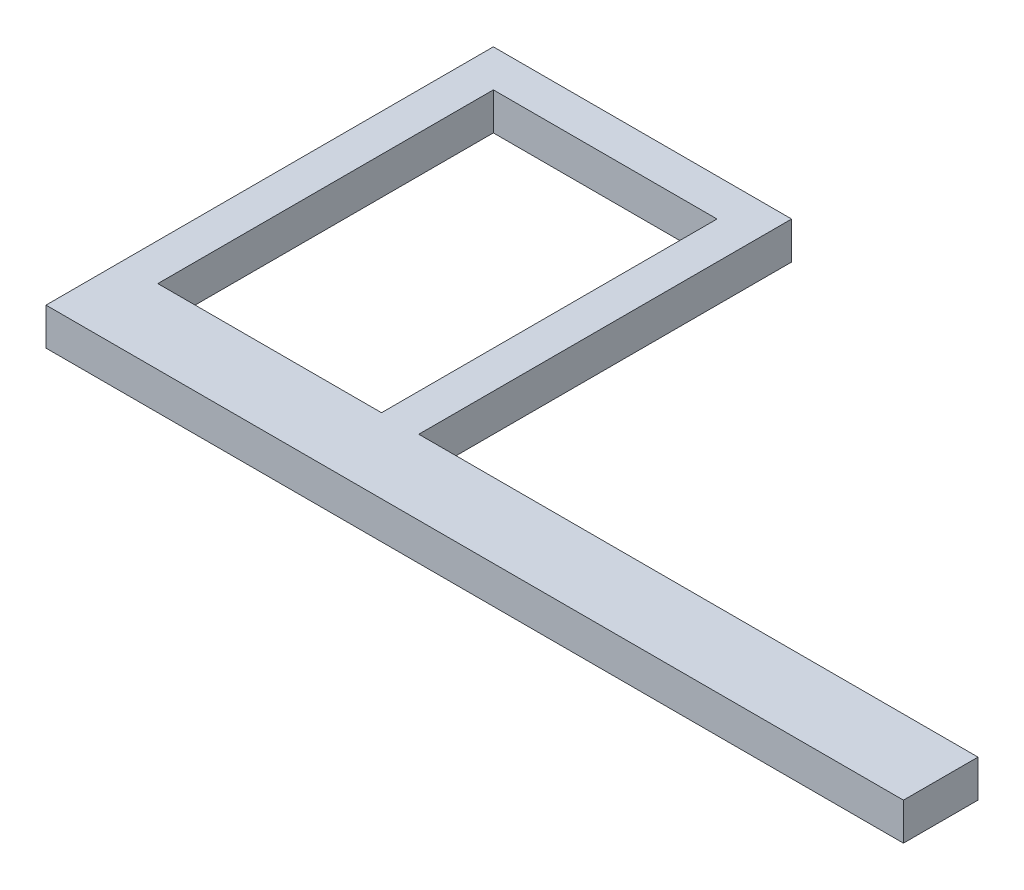
ISO-10303-21;
HEADER;
FILE_DESCRIPTION(('STEP AP214'),'2;1');
FILE_NAME('part.step','',(''),(''),'','','');
FILE_SCHEMA(('AUTOMOTIVE_DESIGN { 1 0 10303 214 1 1 1 1 }'));
ENDSEC;
DATA;
#1=APPLICATION_CONTEXT('core data for automotive mechanical design processes');
#2=APPLICATION_PROTOCOL_DEFINITION('international standard','automotive_design',2000,#1);
#3=PRODUCT_CONTEXT('',#1,'mechanical');
#4=PRODUCT('Part','Part','',(#3));
#5=PRODUCT_RELATED_PRODUCT_CATEGORY('part','',(#4));
#6=PRODUCT_DEFINITION_FORMATION('','',#4);
#7=PRODUCT_DEFINITION_CONTEXT('part definition',#1,'design');
#8=PRODUCT_DEFINITION('design','',#6,#7);
#9=PRODUCT_DEFINITION_SHAPE('','',#8);
#10=(LENGTH_UNIT() NAMED_UNIT(*) SI_UNIT(.MILLI.,.METRE.));
#11=(NAMED_UNIT(*) PLANE_ANGLE_UNIT() SI_UNIT($,.RADIAN.));
#12=(NAMED_UNIT(*) SI_UNIT($,.STERADIAN.) SOLID_ANGLE_UNIT());
#13=UNCERTAINTY_MEASURE_WITH_UNIT(LENGTH_MEASURE(1.E-05),#10,'distance_accuracy_value','');
#14=(GEOMETRIC_REPRESENTATION_CONTEXT(3) GLOBAL_UNCERTAINTY_ASSIGNED_CONTEXT((#13)) GLOBAL_UNIT_ASSIGNED_CONTEXT((#10,
#11,#12)) REPRESENTATION_CONTEXT('',''));
#15=CARTESIAN_POINT('',(0.,0.,0.));
#16=DIRECTION('',(0.,0.,1.));
#17=DIRECTION('',(1.,0.,0.));
#18=AXIS2_PLACEMENT_3D('',#15,#16,#17);
#19=CARTESIAN_POINT('',(-69.9051094890511,5.,-48.4014598540146));
#20=DIRECTION('',(0.,0.,1.));
#21=DIRECTION('',(1.,0.,0.));
#22=AXIS2_PLACEMENT_3D('',#19,#20,#21);
#23=PLANE('',#22);
#24=DIRECTION('',(-1.,0.,0.));
#25=VECTOR('',#24,1.);
#26=CARTESIAN_POINT('',(-69.9051094890511,0.,-48.4014598540146));
#27=LINE('',#26,#25);
#28=CARTESIAN_POINT('',(-69.9051094890511,0.,-48.4014598540146));
#29=VERTEX_POINT('',#28);
#30=CARTESIAN_POINT('',(-109.905109489051,0.,-48.4014598540146));
#31=VERTEX_POINT('',#30);
#32=EDGE_CURVE('E148',#29,#31,#27,.T.);
#33=ORIENTED_EDGE('',*,*,#32,.T.);
#34=DIRECTION('',(0.,-1.,0.));
#35=VECTOR('',#34,1.);
#36=CARTESIAN_POINT('',(-109.905109489051,5.,-48.4014598540146));
#37=LINE('',#36,#35);
#38=CARTESIAN_POINT('',(-109.905109489051,5.,-48.4014598540146));
#39=VERTEX_POINT('',#38);
#40=EDGE_CURVE('E11',#39,#31,#37,.T.);
#41=ORIENTED_EDGE('',*,*,#40,.F.);
#42=DIRECTION('',(-1.,0.,0.));
#43=VECTOR('',#42,1.);
#44=CARTESIAN_POINT('',(-69.9051094890511,5.,-48.4014598540146));
#45=LINE('',#44,#43);
#46=CARTESIAN_POINT('',(-69.9051094890511,5.,-48.4014598540146));
#47=VERTEX_POINT('',#46);
#48=EDGE_CURVE('E152',#47,#39,#45,.T.);
#49=ORIENTED_EDGE('',*,*,#48,.F.);
#50=DIRECTION('',(0.,-1.,0.));
#51=VECTOR('',#50,1.);
#52=CARTESIAN_POINT('',(-69.9051094890511,5.,-48.4014598540146));
#53=LINE('',#52,#51);
#54=EDGE_CURVE('E166',#47,#29,#53,.T.);
#55=ORIENTED_EDGE('',*,*,#54,.T.);
#56=EDGE_LOOP('',(#33,#41,#49,#55));
#57=FACE_BOUND('',#56,.T.);
#58=ADVANCED_FACE('F39',(#57),#23,.F.);
#59=CARTESIAN_POINT('',(-109.905109489051,5.,-48.4014598540146));
#60=DIRECTION('',(1.,0.,0.));
#61=DIRECTION('',(0.,0.,-1.));
#62=AXIS2_PLACEMENT_3D('',#59,#60,#61);
#63=PLANE('',#62);
#64=DIRECTION('',(0.,0.,1.));
#65=VECTOR('',#64,1.);
#66=CARTESIAN_POINT('',(-109.905109489051,0.,-48.4014598540146));
#67=LINE('',#66,#65);
#68=CARTESIAN_POINT('',(-109.905109489051,0.,11.5985401459854));
#69=VERTEX_POINT('',#68);
#70=EDGE_CURVE('E169',#31,#69,#67,.T.);
#71=ORIENTED_EDGE('',*,*,#70,.T.);
#72=DIRECTION('',(0.,-1.,0.));
#73=VECTOR('',#72,1.);
#74=CARTESIAN_POINT('',(-109.905109489051,5.,11.5985401459854));
#75=LINE('',#74,#73);
#76=CARTESIAN_POINT('',(-109.905109489051,5.,11.5985401459854));
#77=VERTEX_POINT('',#76);
#78=EDGE_CURVE('E46',#77,#69,#75,.T.);
#79=ORIENTED_EDGE('',*,*,#78,.F.);
#80=DIRECTION('',(0.,0.,1.));
#81=VECTOR('',#80,1.);
#82=CARTESIAN_POINT('',(-109.905109489051,5.,-48.4014598540146));
#83=LINE('',#82,#81);
#84=EDGE_CURVE('E155',#39,#77,#83,.T.);
#85=ORIENTED_EDGE('',*,*,#84,.F.);
#86=ORIENTED_EDGE('',*,*,#40,.T.);
#87=EDGE_LOOP('',(#71,#79,#85,#86));
#88=FACE_BOUND('',#87,.T.);
#89=ADVANCED_FACE('F214',(#88),#63,.F.);
#90=CARTESIAN_POINT('',(-109.905109489051,5.,11.5985401459854));
#91=DIRECTION('',(0.,0.,-1.));
#92=DIRECTION('',(-1.,0.,0.));
#93=AXIS2_PLACEMENT_3D('',#90,#91,#92);
#94=PLANE('',#93);
#95=DIRECTION('',(1.,0.,0.));
#96=VECTOR('',#95,1.);
#97=CARTESIAN_POINT('',(-109.905109489051,0.,11.5985401459854));
#98=LINE('',#97,#96);
#99=CARTESIAN_POINT('',(5.09489051094891,0.,11.5985401459854));
#100=VERTEX_POINT('',#99);
#101=EDGE_CURVE('E171',#69,#100,#98,.T.);
#102=ORIENTED_EDGE('',*,*,#101,.T.);
#103=DIRECTION('',(0.,-1.,0.));
#104=VECTOR('',#103,1.);
#105=CARTESIAN_POINT('',(5.09489051094891,5.,11.5985401459854));
#106=LINE('',#105,#104);
#107=CARTESIAN_POINT('',(5.09489051094891,5.,11.5985401459854));
#108=VERTEX_POINT('',#107);
#109=EDGE_CURVE('E186',#108,#100,#106,.T.);
#110=ORIENTED_EDGE('',*,*,#109,.F.);
#111=DIRECTION('',(1.,0.,0.));
#112=VECTOR('',#111,1.);
#113=CARTESIAN_POINT('',(-109.905109489051,5.,11.5985401459854));
#114=LINE('',#113,#112);
#115=EDGE_CURVE('E158',#77,#108,#114,.T.);
#116=ORIENTED_EDGE('',*,*,#115,.F.);
#117=ORIENTED_EDGE('',*,*,#78,.T.);
#118=EDGE_LOOP('',(#102,#110,#116,#117));
#119=FACE_BOUND('',#118,.T.);
#120=ADVANCED_FACE('F193',(#119),#94,.F.);
#121=CARTESIAN_POINT('',(5.09489051094891,5.,11.5985401459854));
#122=DIRECTION('',(-1.,0.,0.));
#123=DIRECTION('',(0.,0.,1.));
#124=AXIS2_PLACEMENT_3D('',#121,#122,#123);
#125=PLANE('',#124);
#126=DIRECTION('',(0.,0.,-1.));
#127=VECTOR('',#126,1.);
#128=CARTESIAN_POINT('',(5.09489051094891,0.,11.5985401459854));
#129=LINE('',#128,#127);
#130=CARTESIAN_POINT('',(5.09489051094891,0.,1.5985401459854));
#131=VERTEX_POINT('',#130);
#132=EDGE_CURVE('E173',#100,#131,#129,.T.);
#133=ORIENTED_EDGE('',*,*,#132,.T.);
#134=DIRECTION('',(0.,-1.,0.));
#135=VECTOR('',#134,1.);
#136=CARTESIAN_POINT('',(5.09489051094891,5.,1.5985401459854));
#137=LINE('',#136,#135);
#138=CARTESIAN_POINT('',(5.09489051094891,5.,1.5985401459854));
#139=VERTEX_POINT('',#138);
#140=EDGE_CURVE('E183',#139,#131,#137,.T.);
#141=ORIENTED_EDGE('',*,*,#140,.F.);
#142=DIRECTION('',(0.,0.,-1.));
#143=VECTOR('',#142,1.);
#144=CARTESIAN_POINT('',(5.09489051094891,5.,11.5985401459854));
#145=LINE('',#144,#143);
#146=EDGE_CURVE('E160',#108,#139,#145,.T.);
#147=ORIENTED_EDGE('',*,*,#146,.F.);
#148=ORIENTED_EDGE('',*,*,#109,.T.);
#149=EDGE_LOOP('',(#133,#141,#147,#148));
#150=FACE_BOUND('',#149,.T.);
#151=ADVANCED_FACE('F202',(#150),#125,.F.);
#152=CARTESIAN_POINT('',(5.09489051094891,5.,1.5985401459854));
#153=DIRECTION('',(0.,0.,1.));
#154=DIRECTION('',(1.,0.,0.));
#155=AXIS2_PLACEMENT_3D('',#152,#153,#154);
#156=PLANE('',#155);
#157=DIRECTION('',(-1.,0.,0.));
#158=VECTOR('',#157,1.);
#159=CARTESIAN_POINT('',(5.09489051094891,0.,1.5985401459854));
#160=LINE('',#159,#158);
#161=CARTESIAN_POINT('',(-69.9051094890511,0.,1.59854014598541));
#162=VERTEX_POINT('',#161);
#163=EDGE_CURVE('E175',#131,#162,#160,.T.);
#164=ORIENTED_EDGE('',*,*,#163,.T.);
#165=DIRECTION('',(0.,-1.,0.));
#166=VECTOR('',#165,1.);
#167=CARTESIAN_POINT('',(-69.9051094890511,5.,1.59854014598541));
#168=LINE('',#167,#166);
#169=CARTESIAN_POINT('',(-69.9051094890511,5.,1.59854014598541));
#170=VERTEX_POINT('',#169);
#171=EDGE_CURVE('E180',#170,#162,#168,.T.);
#172=ORIENTED_EDGE('',*,*,#171,.F.);
#173=DIRECTION('',(-1.,0.,0.));
#174=VECTOR('',#173,1.);
#175=CARTESIAN_POINT('',(5.09489051094891,5.,1.5985401459854));
#176=LINE('',#175,#174);
#177=EDGE_CURVE('E162',#139,#170,#176,.T.);
#178=ORIENTED_EDGE('',*,*,#177,.F.);
#179=ORIENTED_EDGE('',*,*,#140,.T.);
#180=EDGE_LOOP('',(#164,#172,#178,#179));
#181=FACE_BOUND('',#180,.T.);
#182=ADVANCED_FACE('F206',(#181),#156,.F.);
#183=CARTESIAN_POINT('',(-69.9051094890511,5.,1.59854014598541));
#184=DIRECTION('',(-1.,0.,0.));
#185=DIRECTION('',(0.,0.,1.));
#186=AXIS2_PLACEMENT_3D('',#183,#184,#185);
#187=PLANE('',#186);
#188=DIRECTION('',(0.,0.,-1.));
#189=VECTOR('',#188,1.);
#190=CARTESIAN_POINT('',(-69.9051094890511,0.,1.59854014598541));
#191=LINE('',#190,#189);
#192=EDGE_CURVE('E156',#162,#29,#191,.T.);
#193=ORIENTED_EDGE('',*,*,#192,.T.);
#194=ORIENTED_EDGE('',*,*,#54,.F.);
#195=DIRECTION('',(0.,0.,-1.));
#196=VECTOR('',#195,1.);
#197=CARTESIAN_POINT('',(-69.9051094890511,5.,1.59854014598541));
#198=LINE('',#197,#196);
#199=EDGE_CURVE('E164',#170,#47,#198,.T.);
#200=ORIENTED_EDGE('',*,*,#199,.F.);
#201=ORIENTED_EDGE('',*,*,#171,.T.);
#202=EDGE_LOOP('',(#193,#194,#200,#201));
#203=FACE_BOUND('',#202,.T.);
#204=ADVANCED_FACE('F217',(#203),#187,.F.);
#205=CARTESIAN_POINT('',(0.,5.,0.));
#206=DIRECTION('',(0.,1.,0.));
#207=DIRECTION('',(0.,0.,1.));
#208=AXIS2_PLACEMENT_3D('',#205,#206,#207);
#209=PLANE('',#208);
#210=DIRECTION('',(0.,0.,1.));
#211=VECTOR('',#210,1.);
#212=CARTESIAN_POINT('',(-104.905109489051,5.,-43.4014598540146));
#213=LINE('',#212,#211);
#214=CARTESIAN_POINT('',(-104.905109489051,5.,-43.4014598540146));
#215=VERTEX_POINT('',#214);
#216=CARTESIAN_POINT('',(-104.905109489051,5.,1.5985401459854));
#217=VERTEX_POINT('',#216);
#218=EDGE_CURVE('E53',#215,#217,#213,.T.);
#219=ORIENTED_EDGE('',*,*,#218,.F.);
#220=DIRECTION('',(-1.,0.,0.));
#221=VECTOR('',#220,1.);
#222=CARTESIAN_POINT('',(-104.905109489051,5.,-43.4014598540146));
#223=LINE('',#222,#221);
#224=CARTESIAN_POINT('',(-74.9051094890511,5.,-43.4014598540146));
#225=VERTEX_POINT('',#224);
#226=EDGE_CURVE('E133',#225,#215,#223,.T.);
#227=ORIENTED_EDGE('',*,*,#226,.F.);
#228=DIRECTION('',(0.,0.,-1.));
#229=VECTOR('',#228,1.);
#230=CARTESIAN_POINT('',(-74.9051094890511,5.,-43.4014598540146));
#231=LINE('',#230,#229);
#232=CARTESIAN_POINT('',(-74.9051094890511,5.,1.5985401459854));
#233=VERTEX_POINT('',#232);
#234=EDGE_CURVE('E136',#233,#225,#231,.T.);
#235=ORIENTED_EDGE('',*,*,#234,.F.);
#236=DIRECTION('',(1.,0.,0.));
#237=VECTOR('',#236,1.);
#238=CARTESIAN_POINT('',(-104.905109489051,5.,1.5985401459854));
#239=LINE('',#238,#237);
#240=EDGE_CURVE('E142',#217,#233,#239,.T.);
#241=ORIENTED_EDGE('',*,*,#240,.F.);
#242=EDGE_LOOP('',(#219,#227,#235,#241));
#243=FACE_BOUND('',#242,.T.);
#244=ORIENTED_EDGE('',*,*,#48,.T.);
#245=ORIENTED_EDGE('',*,*,#84,.T.);
#246=ORIENTED_EDGE('',*,*,#115,.T.);
#247=ORIENTED_EDGE('',*,*,#146,.T.);
#248=ORIENTED_EDGE('',*,*,#177,.T.);
#249=ORIENTED_EDGE('',*,*,#199,.T.);
#250=EDGE_LOOP('',(#244,#245,#246,#247,#248,#249));
#251=FACE_BOUND('',#250,.T.);
#252=ADVANCED_FACE('F210',(#243,#251),#209,.T.);
#253=CARTESIAN_POINT('',(0.,0.,0.));
#254=DIRECTION('',(0.,1.,0.));
#255=DIRECTION('',(0.,0.,1.));
#256=AXIS2_PLACEMENT_3D('',#253,#254,#255);
#257=PLANE('',#256);
#258=DIRECTION('',(-1.,0.,0.));
#259=VECTOR('',#258,1.);
#260=CARTESIAN_POINT('',(-104.905109489051,0.,-43.4014598540146));
#261=LINE('',#260,#259);
#262=CARTESIAN_POINT('',(-74.9051094890511,0.,-43.4014598540146));
#263=VERTEX_POINT('',#262);
#264=CARTESIAN_POINT('',(-104.905109489051,0.,-43.4014598540146));
#265=VERTEX_POINT('',#264);
#266=EDGE_CURVE('E123',#263,#265,#261,.T.);
#267=ORIENTED_EDGE('',*,*,#266,.T.);
#268=DIRECTION('',(0.,0.,1.));
#269=VECTOR('',#268,1.);
#270=CARTESIAN_POINT('',(-104.905109489051,0.,-43.4014598540146));
#271=LINE('',#270,#269);
#272=CARTESIAN_POINT('',(-104.905109489051,0.,1.5985401459854));
#273=VERTEX_POINT('',#272);
#274=EDGE_CURVE('E117',#265,#273,#271,.T.);
#275=ORIENTED_EDGE('',*,*,#274,.T.);
#276=DIRECTION('',(1.,0.,0.));
#277=VECTOR('',#276,1.);
#278=CARTESIAN_POINT('',(-104.905109489051,0.,1.5985401459854));
#279=LINE('',#278,#277);
#280=CARTESIAN_POINT('',(-74.9051094890511,0.,1.5985401459854));
#281=VERTEX_POINT('',#280);
#282=EDGE_CURVE('E126',#273,#281,#279,.T.);
#283=ORIENTED_EDGE('',*,*,#282,.T.);
#284=DIRECTION('',(0.,0.,-1.));
#285=VECTOR('',#284,1.);
#286=CARTESIAN_POINT('',(-74.9051094890511,0.,-43.4014598540146));
#287=LINE('',#286,#285);
#288=EDGE_CURVE('E61',#281,#263,#287,.T.);
#289=ORIENTED_EDGE('',*,*,#288,.T.);
#290=EDGE_LOOP('',(#267,#275,#283,#289));
#291=FACE_BOUND('',#290,.T.);
#292=ORIENTED_EDGE('',*,*,#32,.F.);
#293=ORIENTED_EDGE('',*,*,#192,.F.);
#294=ORIENTED_EDGE('',*,*,#163,.F.);
#295=ORIENTED_EDGE('',*,*,#132,.F.);
#296=ORIENTED_EDGE('',*,*,#101,.F.);
#297=ORIENTED_EDGE('',*,*,#70,.F.);
#298=EDGE_LOOP('',(#292,#293,#294,#295,#296,#297));
#299=FACE_BOUND('',#298,.T.);
#300=ADVANCED_FACE('F130',(#291,#299),#257,.F.);
#301=CARTESIAN_POINT('',(-104.905109489051,0.,-43.4014598540146));
#302=DIRECTION('',(-1.,0.,0.));
#303=DIRECTION('',(0.,0.,1.));
#304=AXIS2_PLACEMENT_3D('',#301,#302,#303);
#305=PLANE('',#304);
#306=ORIENTED_EDGE('',*,*,#218,.T.);
#307=DIRECTION('',(0.,1.,0.));
#308=VECTOR('',#307,1.);
#309=CARTESIAN_POINT('',(-104.905109489051,0.,1.5985401459854));
#310=LINE('',#309,#308);
#311=EDGE_CURVE('E113',#273,#217,#310,.T.);
#312=ORIENTED_EDGE('',*,*,#311,.F.);
#313=ORIENTED_EDGE('',*,*,#274,.F.);
#314=DIRECTION('',(0.,1.,0.));
#315=VECTOR('',#314,1.);
#316=CARTESIAN_POINT('',(-104.905109489051,0.,-43.4014598540146));
#317=LINE('',#316,#315);
#318=EDGE_CURVE('E146',#265,#215,#317,.T.);
#319=ORIENTED_EDGE('',*,*,#318,.T.);
#320=EDGE_LOOP('',(#306,#312,#313,#319));
#321=FACE_BOUND('',#320,.T.);
#322=ADVANCED_FACE('F115',(#321),#305,.F.);
#323=CARTESIAN_POINT('',(-104.905109489051,0.,-43.4014598540146));
#324=DIRECTION('',(0.,0.,-1.));
#325=DIRECTION('',(-1.,0.,0.));
#326=AXIS2_PLACEMENT_3D('',#323,#324,#325);
#327=PLANE('',#326);
#328=ORIENTED_EDGE('',*,*,#226,.T.);
#329=ORIENTED_EDGE('',*,*,#318,.F.);
#330=ORIENTED_EDGE('',*,*,#266,.F.);
#331=DIRECTION('',(0.,1.,0.));
#332=VECTOR('',#331,1.);
#333=CARTESIAN_POINT('',(-74.9051094890511,0.,-43.4014598540146));
#334=LINE('',#333,#332);
#335=EDGE_CURVE('E149',#263,#225,#334,.T.);
#336=ORIENTED_EDGE('',*,*,#335,.T.);
#337=EDGE_LOOP('',(#328,#329,#330,#336));
#338=FACE_BOUND('',#337,.T.);
#339=ADVANCED_FACE('F274',(#338),#327,.F.);
#340=CARTESIAN_POINT('',(-74.9051094890511,0.,-43.4014598540146));
#341=DIRECTION('',(1.,0.,0.));
#342=DIRECTION('',(0.,0.,-1.));
#343=AXIS2_PLACEMENT_3D('',#340,#341,#342);
#344=PLANE('',#343);
#345=ORIENTED_EDGE('',*,*,#234,.T.);
#346=ORIENTED_EDGE('',*,*,#335,.F.);
#347=ORIENTED_EDGE('',*,*,#288,.F.);
#348=DIRECTION('',(0.,1.,0.));
#349=VECTOR('',#348,1.);
#350=CARTESIAN_POINT('',(-74.9051094890511,0.,1.5985401459854));
#351=LINE('',#350,#349);
#352=EDGE_CURVE('E122',#281,#233,#351,.T.);
#353=ORIENTED_EDGE('',*,*,#352,.T.);
#354=EDGE_LOOP('',(#345,#346,#347,#353));
#355=FACE_BOUND('',#354,.T.);
#356=ADVANCED_FACE('F283',(#355),#344,.F.);
#357=CARTESIAN_POINT('',(-104.905109489051,0.,1.5985401459854));
#358=DIRECTION('',(0.,0.,1.));
#359=DIRECTION('',(1.,0.,0.));
#360=AXIS2_PLACEMENT_3D('',#357,#358,#359);
#361=PLANE('',#360);
#362=ORIENTED_EDGE('',*,*,#240,.T.);
#363=ORIENTED_EDGE('',*,*,#352,.F.);
#364=ORIENTED_EDGE('',*,*,#282,.F.);
#365=ORIENTED_EDGE('',*,*,#311,.T.);
#366=EDGE_LOOP('',(#362,#363,#364,#365));
#367=FACE_BOUND('',#366,.T.);
#368=ADVANCED_FACE('F127',(#367),#361,.F.);
#369=CLOSED_SHELL('',(#58,#89,#120,#151,#182,#204,#252,#300,#322,#339,#356,#368));
#370=MANIFOLD_SOLID_BREP('B2',#369);
#371=ADVANCED_BREP_SHAPE_REPRESENTATION('',(#18,#370),#14);
#372=SHAPE_DEFINITION_REPRESENTATION(#9,#371);
ENDSEC;
END-ISO-10303-21;
